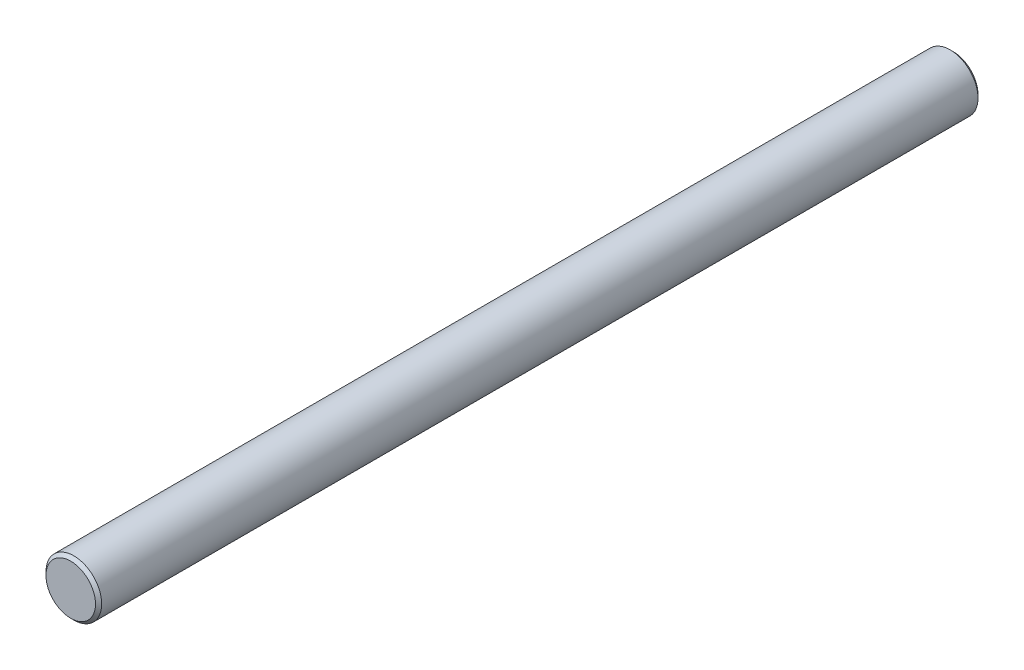
ISO-10303-21;
HEADER;
FILE_DESCRIPTION(('STEP AP214'),'2;1');
FILE_NAME('part.step','',(''),(''),'','','');
FILE_SCHEMA(('AUTOMOTIVE_DESIGN { 1 0 10303 214 1 1 1 1 }'));
ENDSEC;
DATA;
#1=APPLICATION_CONTEXT('core data for automotive mechanical design processes');
#2=APPLICATION_PROTOCOL_DEFINITION('international standard','automotive_design',2000,#1);
#3=PRODUCT_CONTEXT('',#1,'mechanical');
#4=PRODUCT('Part','Part','',(#3));
#5=PRODUCT_RELATED_PRODUCT_CATEGORY('part','',(#4));
#6=PRODUCT_DEFINITION_FORMATION('','',#4);
#7=PRODUCT_DEFINITION_CONTEXT('part definition',#1,'design');
#8=PRODUCT_DEFINITION('design','',#6,#7);
#9=PRODUCT_DEFINITION_SHAPE('','',#8);
#10=(LENGTH_UNIT() NAMED_UNIT(*) SI_UNIT(.MILLI.,.METRE.));
#11=(NAMED_UNIT(*) PLANE_ANGLE_UNIT() SI_UNIT($,.RADIAN.));
#12=(NAMED_UNIT(*) SI_UNIT($,.STERADIAN.) SOLID_ANGLE_UNIT());
#13=UNCERTAINTY_MEASURE_WITH_UNIT(LENGTH_MEASURE(1.E-05),#10,'distance_accuracy_value','');
#14=(GEOMETRIC_REPRESENTATION_CONTEXT(3) GLOBAL_UNCERTAINTY_ASSIGNED_CONTEXT((#13)) GLOBAL_UNIT_ASSIGNED_CONTEXT((#10,
#11,#12)) REPRESENTATION_CONTEXT('',''));
#15=CARTESIAN_POINT('',(0.,0.,0.));
#16=DIRECTION('',(0.,0.,1.));
#17=DIRECTION('',(1.,0.,0.));
#18=AXIS2_PLACEMENT_3D('',#15,#16,#17);
#19=CARTESIAN_POINT('',(0.,0.,72.39));
#20=DIRECTION('',(0.,0.,-1.));
#21=DIRECTION('',(-1.,0.,0.));
#22=AXIS2_PLACEMENT_3D('',#19,#20,#21);
#23=CYLINDRICAL_SURFACE('',#22,2.286);
#24=CARTESIAN_POINT('',(0.,0.,0.25399999999999));
#25=DIRECTION('',(0.,0.,1.));
#26=DIRECTION('',(1.,0.,0.));
#27=AXIS2_PLACEMENT_3D('',#24,#25,#26);
#28=CIRCLE('',#27,2.286);
#29=CARTESIAN_POINT('',(2.286,0.,0.25399999999999));
#30=VERTEX_POINT('',#29);
#31=EDGE_CURVE('E42',#30,#30,#28,.T.);
#32=ORIENTED_EDGE('',*,*,#31,.T.);
#33=EDGE_LOOP('',(#32));
#34=FACE_BOUND('',#33,.T.);
#35=CARTESIAN_POINT('',(0.,0.,72.136));
#36=DIRECTION('',(0.,0.,1.));
#37=DIRECTION('',(1.,0.,0.));
#38=AXIS2_PLACEMENT_3D('',#35,#36,#37);
#39=CIRCLE('',#38,2.286);
#40=CARTESIAN_POINT('',(2.286,0.,72.136));
#41=VERTEX_POINT('',#40);
#42=EDGE_CURVE('E46',#41,#41,#39,.F.);
#43=ORIENTED_EDGE('',*,*,#42,.T.);
#44=EDGE_LOOP('',(#43));
#45=FACE_BOUND('',#44,.T.);
#46=ADVANCED_FACE('F31',(#34,#45),#23,.T.);
#47=CARTESIAN_POINT('',(0.,0.,72.39));
#48=DIRECTION('',(0.,0.,1.));
#49=DIRECTION('',(1.,0.,0.));
#50=AXIS2_PLACEMENT_3D('',#47,#48,#49);
#51=PLANE('',#50);
#52=CARTESIAN_POINT('',(0.,0.,72.39));
#53=DIRECTION('',(0.,0.,1.));
#54=DIRECTION('',(1.,0.,0.));
#55=AXIS2_PLACEMENT_3D('',#52,#53,#54);
#56=CIRCLE('',#55,2.03199999999999);
#57=CARTESIAN_POINT('',(2.03199999999999,0.,72.39));
#58=VERTEX_POINT('',#57);
#59=EDGE_CURVE('E10',#58,#58,#56,.T.);
#60=ORIENTED_EDGE('',*,*,#59,.T.);
#61=EDGE_LOOP('',(#60));
#62=FACE_BOUND('',#61,.T.);
#63=ADVANCED_FACE('F62',(#62),#51,.T.);
#64=CARTESIAN_POINT('',(0.,0.,0.));
#65=DIRECTION('',(0.,0.,1.));
#66=DIRECTION('',(1.,0.,0.));
#67=AXIS2_PLACEMENT_3D('',#64,#65,#66);
#68=PLANE('',#67);
#69=CARTESIAN_POINT('',(0.,0.,0.));
#70=DIRECTION('',(0.,0.,1.));
#71=DIRECTION('',(1.,0.,0.));
#72=AXIS2_PLACEMENT_3D('',#69,#70,#71);
#73=CIRCLE('',#72,2.032);
#74=CARTESIAN_POINT('',(2.032,0.,0.));
#75=VERTEX_POINT('',#74);
#76=EDGE_CURVE('E38',#75,#75,#73,.F.);
#77=ORIENTED_EDGE('',*,*,#76,.T.);
#78=EDGE_LOOP('',(#77));
#79=FACE_BOUND('',#78,.T.);
#80=ADVANCED_FACE('F59',(#79),#68,.F.);
#81=CARTESIAN_POINT('',(0.,0.,0.25399999999999));
#82=DIRECTION('',(0.,0.,1.));
#83=DIRECTION('',(1.,0.,0.));
#84=AXIS2_PLACEMENT_3D('',#81,#82,#83);
#85=CONICAL_SURFACE('',#84,2.286,0.785398163397469);
#86=ORIENTED_EDGE('',*,*,#76,.F.);
#87=EDGE_LOOP('',(#86));
#88=FACE_BOUND('',#87,.T.);
#89=ORIENTED_EDGE('',*,*,#31,.F.);
#90=EDGE_LOOP('',(#89));
#91=FACE_BOUND('',#90,.T.);
#92=ADVANCED_FACE('F55',(#88,#91),#85,.T.);
#93=CARTESIAN_POINT('',(0.,0.,72.39));
#94=DIRECTION('',(0.,0.,-1.));
#95=DIRECTION('',(-1.,0.,0.));
#96=AXIS2_PLACEMENT_3D('',#93,#94,#95);
#97=CONICAL_SURFACE('',#96,2.03199999999999,0.785398163397442);
#98=ORIENTED_EDGE('',*,*,#42,.F.);
#99=EDGE_LOOP('',(#98));
#100=FACE_BOUND('',#99,.T.);
#101=ORIENTED_EDGE('',*,*,#59,.F.);
#102=EDGE_LOOP('',(#101));
#103=FACE_BOUND('',#102,.T.);
#104=ADVANCED_FACE('F33',(#100,#103),#97,.T.);
#105=CLOSED_SHELL('',(#46,#63,#80,#92,#104));
#106=MANIFOLD_SOLID_BREP('B2',#105);
#107=ADVANCED_BREP_SHAPE_REPRESENTATION('',(#18,#106),#14);
#108=SHAPE_DEFINITION_REPRESENTATION(#9,#107);
ENDSEC;
END-ISO-10303-21;
